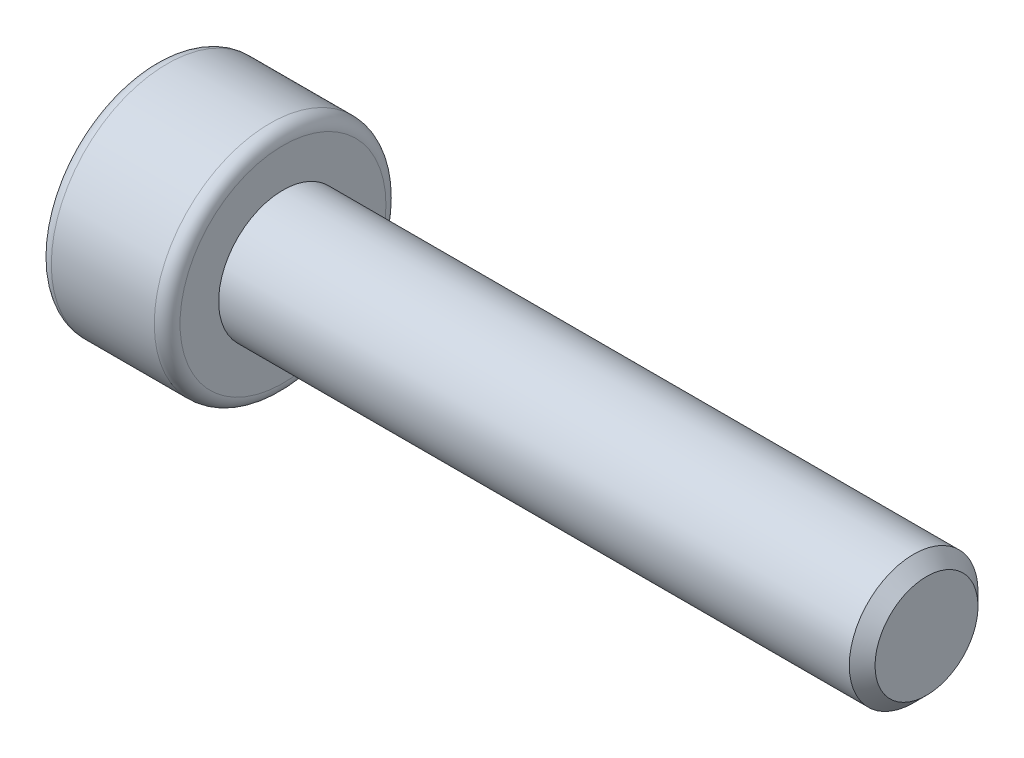
ISO-10303-21;
HEADER;
FILE_DESCRIPTION(('STEP AP214'),'2;1');
FILE_NAME('part.step','',(''),(''),'','','');
FILE_SCHEMA(('AUTOMOTIVE_DESIGN { 1 0 10303 214 1 1 1 1 }'));
ENDSEC;
DATA;
#1=APPLICATION_CONTEXT('core data for automotive mechanical design processes');
#2=APPLICATION_PROTOCOL_DEFINITION('international standard','automotive_design',2000,#1);
#3=PRODUCT_CONTEXT('',#1,'mechanical');
#4=PRODUCT('Part','Part','',(#3));
#5=PRODUCT_RELATED_PRODUCT_CATEGORY('part','',(#4));
#6=PRODUCT_DEFINITION_FORMATION('','',#4);
#7=PRODUCT_DEFINITION_CONTEXT('part definition',#1,'design');
#8=PRODUCT_DEFINITION('design','',#6,#7);
#9=PRODUCT_DEFINITION_SHAPE('','',#8);
#10=(LENGTH_UNIT() NAMED_UNIT(*) SI_UNIT(.MILLI.,.METRE.));
#11=(NAMED_UNIT(*) PLANE_ANGLE_UNIT() SI_UNIT($,.RADIAN.));
#12=(NAMED_UNIT(*) SI_UNIT($,.STERADIAN.) SOLID_ANGLE_UNIT());
#13=UNCERTAINTY_MEASURE_WITH_UNIT(LENGTH_MEASURE(1.E-05),#10,'distance_accuracy_value','');
#14=(GEOMETRIC_REPRESENTATION_CONTEXT(3) GLOBAL_UNCERTAINTY_ASSIGNED_CONTEXT((#13)) GLOBAL_UNIT_ASSIGNED_CONTEXT((#10,
#11,#12)) REPRESENTATION_CONTEXT('',''));
#15=CARTESIAN_POINT('',(0.,0.,0.));
#16=DIRECTION('',(0.,0.,1.));
#17=DIRECTION('',(1.,0.,0.));
#18=AXIS2_PLACEMENT_3D('',#15,#16,#17);
#19=CARTESIAN_POINT('',(-6.,0.,0.));
#20=DIRECTION('',(-1.,0.,0.));
#21=DIRECTION('',(0.,0.,1.));
#22=AXIS2_PLACEMENT_3D('',#19,#20,#21);
#23=PLANE('',#22);
#24=CARTESIAN_POINT('',(-6.,0.,0.));
#25=DIRECTION('',(-1.,0.,0.));
#26=DIRECTION('',(0.,0.,1.));
#27=AXIS2_PLACEMENT_3D('',#24,#25,#26);
#28=CIRCLE('',#27,1.6);
#29=CARTESIAN_POINT('',(-6.,0.,1.6));
#30=VERTEX_POINT('',#29);
#31=EDGE_CURVE('E157',#30,#30,#28,.T.);
#32=ORIENTED_EDGE('',*,*,#31,.T.);
#33=EDGE_LOOP('',(#32));
#34=FACE_BOUND('',#33,.T.);
#35=DIRECTION('',(0.,0.866025403784439,0.5));
#36=VECTOR('',#35,1.);
#37=CARTESIAN_POINT('',(-6.,-0.75,0.43301270189222));
#38=LINE('',#37,#36);
#39=CARTESIAN_POINT('',(-6.,-0.75,0.43301270189222));
#40=VERTEX_POINT('',#39);
#41=CARTESIAN_POINT('',(-6.,0.,0.866025403784439));
#42=VERTEX_POINT('',#41);
#43=EDGE_CURVE('E53',#40,#42,#38,.T.);
#44=ORIENTED_EDGE('',*,*,#43,.F.);
#45=DIRECTION('',(0.,0.,1.));
#46=VECTOR('',#45,1.);
#47=CARTESIAN_POINT('',(-6.,-0.75,-0.433012701892219));
#48=LINE('',#47,#46);
#49=CARTESIAN_POINT('',(-6.,-0.75,-0.433012701892219));
#50=VERTEX_POINT('',#49);
#51=EDGE_CURVE('E136',#50,#40,#48,.T.);
#52=ORIENTED_EDGE('',*,*,#51,.F.);
#53=DIRECTION('',(0.,-0.866025403784438,0.5));
#54=VECTOR('',#53,1.);
#55=CARTESIAN_POINT('',(-6.,0.,-0.866025403784439));
#56=LINE('',#55,#54);
#57=CARTESIAN_POINT('',(-6.,0.,-0.866025403784439));
#58=VERTEX_POINT('',#57);
#59=EDGE_CURVE('E134',#58,#50,#56,.T.);
#60=ORIENTED_EDGE('',*,*,#59,.F.);
#61=DIRECTION('',(0.,-0.866025403784438,-0.5));
#62=VECTOR('',#61,1.);
#63=CARTESIAN_POINT('',(-6.,0.75,-0.433012701892219));
#64=LINE('',#63,#62);
#65=CARTESIAN_POINT('',(-6.,0.75,-0.433012701892219));
#66=VERTEX_POINT('',#65);
#67=EDGE_CURVE('E101',#66,#58,#64,.T.);
#68=ORIENTED_EDGE('',*,*,#67,.F.);
#69=DIRECTION('',(0.,0.,-1.));
#70=VECTOR('',#69,1.);
#71=CARTESIAN_POINT('',(-6.,0.75,0.433012701892219));
#72=LINE('',#71,#70);
#73=CARTESIAN_POINT('',(-6.,0.75,0.433012701892219));
#74=VERTEX_POINT('',#73);
#75=EDGE_CURVE('E130',#74,#66,#72,.T.);
#76=ORIENTED_EDGE('',*,*,#75,.F.);
#77=DIRECTION('',(0.,0.866025403784438,-0.5));
#78=VECTOR('',#77,1.);
#79=CARTESIAN_POINT('',(-6.,0.,0.866025403784439));
#80=LINE('',#79,#78);
#81=EDGE_CURVE('E127',#42,#74,#80,.T.);
#82=ORIENTED_EDGE('',*,*,#81,.F.);
#83=EDGE_LOOP('',(#44,#52,#60,#68,#76,#82));
#84=FACE_BOUND('',#83,.T.);
#85=ADVANCED_FACE('F37',(#34,#84),#23,.T.);
#86=CARTESIAN_POINT('',(6.,0.,0.));
#87=DIRECTION('',(1.,0.,0.));
#88=DIRECTION('',(0.,0.,-1.));
#89=AXIS2_PLACEMENT_3D('',#86,#87,#88);
#90=CYLINDRICAL_SURFACE('',#89,1.8);
#91=CARTESIAN_POINT('',(-4.2,0.,0.));
#92=DIRECTION('',(1.,0.,0.));
#93=DIRECTION('',(0.,0.,-1.));
#94=AXIS2_PLACEMENT_3D('',#91,#92,#93);
#95=CIRCLE('',#94,1.8);
#96=CARTESIAN_POINT('',(-4.2,0.,-1.8));
#97=VERTEX_POINT('',#96);
#98=EDGE_CURVE('E154',#97,#97,#95,.F.);
#99=ORIENTED_EDGE('',*,*,#98,.T.);
#100=EDGE_LOOP('',(#99));
#101=FACE_BOUND('',#100,.T.);
#102=CARTESIAN_POINT('',(-5.8,0.,0.));
#103=DIRECTION('',(-1.,0.,0.));
#104=DIRECTION('',(0.,0.,1.));
#105=AXIS2_PLACEMENT_3D('',#102,#103,#104);
#106=CIRCLE('',#105,1.8);
#107=CARTESIAN_POINT('',(-5.8,0.,1.8));
#108=VERTEX_POINT('',#107);
#109=EDGE_CURVE('E151',#108,#108,#106,.F.);
#110=ORIENTED_EDGE('',*,*,#109,.T.);
#111=EDGE_LOOP('',(#110));
#112=FACE_BOUND('',#111,.T.);
#113=ADVANCED_FACE('F174',(#101,#112),#90,.T.);
#114=CARTESIAN_POINT('',(-4.,1.8,0.));
#115=DIRECTION('',(1.,0.,0.));
#116=DIRECTION('',(0.,0.,-1.));
#117=AXIS2_PLACEMENT_3D('',#114,#115,#116);
#118=PLANE('',#117);
#119=CARTESIAN_POINT('',(-4.,0.,0.));
#120=DIRECTION('',(1.,0.,0.));
#121=DIRECTION('',(0.,0.,-1.));
#122=AXIS2_PLACEMENT_3D('',#119,#120,#121);
#123=CIRCLE('',#122,1.6);
#124=CARTESIAN_POINT('',(-4.,0.,-1.6));
#125=VERTEX_POINT('',#124);
#126=EDGE_CURVE('E148',#125,#125,#123,.T.);
#127=ORIENTED_EDGE('',*,*,#126,.T.);
#128=EDGE_LOOP('',(#127));
#129=FACE_BOUND('',#128,.T.);
#130=CARTESIAN_POINT('',(-4.,0.,0.));
#131=DIRECTION('',(1.,0.,0.));
#132=DIRECTION('',(0.,0.,-1.));
#133=AXIS2_PLACEMENT_3D('',#130,#131,#132);
#134=CIRCLE('',#133,1.);
#135=CARTESIAN_POINT('',(-4.,0.,-1.));
#136=VERTEX_POINT('',#135);
#137=EDGE_CURVE('E140',#136,#136,#134,.T.);
#138=ORIENTED_EDGE('',*,*,#137,.F.);
#139=EDGE_LOOP('',(#138));
#140=FACE_BOUND('',#139,.T.);
#141=ADVANCED_FACE('F180',(#129,#140),#118,.T.);
#142=CARTESIAN_POINT('',(6.,0.,0.));
#143=DIRECTION('',(1.,0.,0.));
#144=DIRECTION('',(0.,0.,-1.));
#145=AXIS2_PLACEMENT_3D('',#142,#143,#144);
#146=CYLINDRICAL_SURFACE('',#145,1.);
#147=CARTESIAN_POINT('',(5.8,0.,0.));
#148=DIRECTION('',(1.,0.,0.));
#149=DIRECTION('',(0.,0.,-1.));
#150=AXIS2_PLACEMENT_3D('',#147,#148,#149);
#151=CIRCLE('',#150,1.);
#152=CARTESIAN_POINT('',(5.8,0.,1.));
#153=VERTEX_POINT('',#152);
#154=EDGE_CURVE('E11',#153,#153,#151,.F.);
#155=ORIENTED_EDGE('',*,*,#154,.T.);
#156=EDGE_LOOP('',(#155));
#157=FACE_BOUND('',#156,.T.);
#158=ORIENTED_EDGE('',*,*,#137,.T.);
#159=EDGE_LOOP('',(#158));
#160=FACE_BOUND('',#159,.T.);
#161=ADVANCED_FACE('F199',(#157,#160),#146,.T.);
#162=CARTESIAN_POINT('',(6.,1.,0.));
#163=DIRECTION('',(1.,0.,0.));
#164=DIRECTION('',(0.,0.,-1.));
#165=AXIS2_PLACEMENT_3D('',#162,#163,#164);
#166=PLANE('',#165);
#167=CARTESIAN_POINT('',(6.,0.,0.));
#168=DIRECTION('',(1.,0.,0.));
#169=DIRECTION('',(0.,0.,-1.));
#170=AXIS2_PLACEMENT_3D('',#167,#168,#169);
#171=CIRCLE('',#170,0.800000000000002);
#172=CARTESIAN_POINT('',(6.,0.,0.800000000000002));
#173=VERTEX_POINT('',#172);
#174=EDGE_CURVE('E46',#173,#173,#171,.T.);
#175=ORIENTED_EDGE('',*,*,#174,.T.);
#176=EDGE_LOOP('',(#175));
#177=FACE_BOUND('',#176,.T.);
#178=ADVANCED_FACE('F162',(#177),#166,.T.);
#179=CARTESIAN_POINT('',(-4.5,-0.75,0.43301270189222));
#180=DIRECTION('',(0.,-0.5,0.866025403784439));
#181=DIRECTION('',(0.,-0.866025403784439,-0.5));
#182=AXIS2_PLACEMENT_3D('',#179,#180,#181);
#183=PLANE('',#182);
#184=ORIENTED_EDGE('',*,*,#43,.T.);
#185=DIRECTION('',(-1.,0.,0.));
#186=VECTOR('',#185,1.);
#187=CARTESIAN_POINT('',(-4.5,0.,0.866025403784439));
#188=LINE('',#187,#186);
#189=CARTESIAN_POINT('',(-4.5,0.,0.866025403784439));
#190=VERTEX_POINT('',#189);
#191=EDGE_CURVE('E83',#190,#42,#188,.T.);
#192=ORIENTED_EDGE('',*,*,#191,.F.);
#193=DIRECTION('',(0.,0.866025403784439,0.5));
#194=VECTOR('',#193,1.);
#195=CARTESIAN_POINT('',(-4.5,-0.75,0.43301270189222));
#196=LINE('',#195,#194);
#197=CARTESIAN_POINT('',(-4.5,-0.75,0.43301270189222));
#198=VERTEX_POINT('',#197);
#199=EDGE_CURVE('E138',#198,#190,#196,.T.);
#200=ORIENTED_EDGE('',*,*,#199,.F.);
#201=DIRECTION('',(-1.,0.,0.));
#202=VECTOR('',#201,1.);
#203=CARTESIAN_POINT('',(-4.5,-0.75,0.43301270189222));
#204=LINE('',#203,#202);
#205=EDGE_CURVE('E61',#198,#40,#204,.T.);
#206=ORIENTED_EDGE('',*,*,#205,.T.);
#207=EDGE_LOOP('',(#184,#192,#200,#206));
#208=FACE_BOUND('',#207,.T.);
#209=ADVANCED_FACE('F208',(#208),#183,.F.);
#210=CARTESIAN_POINT('',(-4.5,-0.75,-0.433012701892219));
#211=DIRECTION('',(0.,-1.,0.));
#212=DIRECTION('',(0.,0.,-1.));
#213=AXIS2_PLACEMENT_3D('',#210,#211,#212);
#214=PLANE('',#213);
#215=ORIENTED_EDGE('',*,*,#51,.T.);
#216=ORIENTED_EDGE('',*,*,#205,.F.);
#217=DIRECTION('',(0.,0.,1.));
#218=VECTOR('',#217,1.);
#219=CARTESIAN_POINT('',(-4.5,-0.75,-0.433012701892219));
#220=LINE('',#219,#218);
#221=CARTESIAN_POINT('',(-4.5,-0.75,-0.433012701892219));
#222=VERTEX_POINT('',#221);
#223=EDGE_CURVE('E113',#222,#198,#220,.T.);
#224=ORIENTED_EDGE('',*,*,#223,.F.);
#225=DIRECTION('',(-1.,0.,0.));
#226=VECTOR('',#225,1.);
#227=CARTESIAN_POINT('',(-4.5,-0.75,-0.433012701892219));
#228=LINE('',#227,#226);
#229=EDGE_CURVE('E105',#222,#50,#228,.T.);
#230=ORIENTED_EDGE('',*,*,#229,.T.);
#231=EDGE_LOOP('',(#215,#216,#224,#230));
#232=FACE_BOUND('',#231,.T.);
#233=ADVANCED_FACE('F213',(#232),#214,.F.);
#234=CARTESIAN_POINT('',(-4.5,0.,-0.866025403784439));
#235=DIRECTION('',(0.,-0.5,-0.866025403784438));
#236=DIRECTION('',(0.,0.866025403784439,-0.5));
#237=AXIS2_PLACEMENT_3D('',#234,#235,#236);
#238=PLANE('',#237);
#239=ORIENTED_EDGE('',*,*,#59,.T.);
#240=ORIENTED_EDGE('',*,*,#229,.F.);
#241=DIRECTION('',(0.,-0.866025403784438,0.5));
#242=VECTOR('',#241,1.);
#243=CARTESIAN_POINT('',(-4.5,0.,-0.866025403784439));
#244=LINE('',#243,#242);
#245=CARTESIAN_POINT('',(-4.5,0.,-0.866025403784439));
#246=VERTEX_POINT('',#245);
#247=EDGE_CURVE('E109',#246,#222,#244,.T.);
#248=ORIENTED_EDGE('',*,*,#247,.F.);
#249=DIRECTION('',(-1.,0.,0.));
#250=VECTOR('',#249,1.);
#251=CARTESIAN_POINT('',(-4.5,0.,-0.866025403784439));
#252=LINE('',#251,#250);
#253=EDGE_CURVE('E94',#246,#58,#252,.T.);
#254=ORIENTED_EDGE('',*,*,#253,.T.);
#255=EDGE_LOOP('',(#239,#240,#248,#254));
#256=FACE_BOUND('',#255,.T.);
#257=ADVANCED_FACE('F110',(#256),#238,.F.);
#258=CARTESIAN_POINT('',(-4.5,0.75,-0.433012701892219));
#259=DIRECTION('',(0.,0.5,-0.866025403784439));
#260=DIRECTION('',(0.,0.866025403784439,0.5));
#261=AXIS2_PLACEMENT_3D('',#258,#259,#260);
#262=PLANE('',#261);
#263=ORIENTED_EDGE('',*,*,#67,.T.);
#264=ORIENTED_EDGE('',*,*,#253,.F.);
#265=DIRECTION('',(0.,-0.866025403784438,-0.5));
#266=VECTOR('',#265,1.);
#267=CARTESIAN_POINT('',(-4.5,0.75,-0.433012701892219));
#268=LINE('',#267,#266);
#269=CARTESIAN_POINT('',(-4.5,0.75,-0.433012701892219));
#270=VERTEX_POINT('',#269);
#271=EDGE_CURVE('E98',#270,#246,#268,.T.);
#272=ORIENTED_EDGE('',*,*,#271,.F.);
#273=DIRECTION('',(-1.,0.,0.));
#274=VECTOR('',#273,1.);
#275=CARTESIAN_POINT('',(-4.5,0.75,-0.433012701892219));
#276=LINE('',#275,#274);
#277=EDGE_CURVE('E106',#270,#66,#276,.T.);
#278=ORIENTED_EDGE('',*,*,#277,.T.);
#279=EDGE_LOOP('',(#263,#264,#272,#278));
#280=FACE_BOUND('',#279,.T.);
#281=ADVANCED_FACE('F96',(#280),#262,.F.);
#282=CARTESIAN_POINT('',(-4.5,0.75,0.433012701892219));
#283=DIRECTION('',(0.,1.,0.));
#284=DIRECTION('',(0.,0.,1.));
#285=AXIS2_PLACEMENT_3D('',#282,#283,#284);
#286=PLANE('',#285);
#287=ORIENTED_EDGE('',*,*,#75,.T.);
#288=ORIENTED_EDGE('',*,*,#277,.F.);
#289=DIRECTION('',(0.,0.,-1.));
#290=VECTOR('',#289,1.);
#291=CARTESIAN_POINT('',(-4.5,0.75,0.433012701892219));
#292=LINE('',#291,#290);
#293=CARTESIAN_POINT('',(-4.5,0.75,0.433012701892219));
#294=VERTEX_POINT('',#293);
#295=EDGE_CURVE('E119',#294,#270,#292,.T.);
#296=ORIENTED_EDGE('',*,*,#295,.F.);
#297=DIRECTION('',(-1.,0.,0.));
#298=VECTOR('',#297,1.);
#299=CARTESIAN_POINT('',(-4.5,0.75,0.433012701892219));
#300=LINE('',#299,#298);
#301=EDGE_CURVE('E143',#294,#74,#300,.T.);
#302=ORIENTED_EDGE('',*,*,#301,.T.);
#303=EDGE_LOOP('',(#287,#288,#296,#302));
#304=FACE_BOUND('',#303,.T.);
#305=ADVANCED_FACE('F216',(#304),#286,.F.);
#306=CARTESIAN_POINT('',(-4.5,0.,0.866025403784439));
#307=DIRECTION('',(0.,0.5,0.866025403784439));
#308=DIRECTION('',(0.,-0.866025403784439,0.5));
#309=AXIS2_PLACEMENT_3D('',#306,#307,#308);
#310=PLANE('',#309);
#311=ORIENTED_EDGE('',*,*,#81,.T.);
#312=ORIENTED_EDGE('',*,*,#301,.F.);
#313=DIRECTION('',(0.,0.866025403784438,-0.5));
#314=VECTOR('',#313,1.);
#315=CARTESIAN_POINT('',(-4.5,0.,0.866025403784439));
#316=LINE('',#315,#314);
#317=EDGE_CURVE('E121',#190,#294,#316,.T.);
#318=ORIENTED_EDGE('',*,*,#317,.F.);
#319=ORIENTED_EDGE('',*,*,#191,.T.);
#320=EDGE_LOOP('',(#311,#312,#318,#319));
#321=FACE_BOUND('',#320,.T.);
#322=ADVANCED_FACE('F191',(#321),#310,.F.);
#323=CARTESIAN_POINT('',(-4.5,0.,0.));
#324=DIRECTION('',(-1.,0.,0.));
#325=DIRECTION('',(0.,0.,1.));
#326=AXIS2_PLACEMENT_3D('',#323,#324,#325);
#327=PLANE('',#326);
#328=ORIENTED_EDGE('',*,*,#199,.T.);
#329=ORIENTED_EDGE('',*,*,#317,.T.);
#330=ORIENTED_EDGE('',*,*,#295,.T.);
#331=ORIENTED_EDGE('',*,*,#271,.T.);
#332=ORIENTED_EDGE('',*,*,#247,.T.);
#333=ORIENTED_EDGE('',*,*,#223,.T.);
#334=EDGE_LOOP('',(#328,#329,#330,#331,#332,#333));
#335=FACE_BOUND('',#334,.T.);
#336=ADVANCED_FACE('F116',(#335),#327,.T.);
#337=CARTESIAN_POINT('',(-4.2,0.,0.));
#338=DIRECTION('',(1.,0.,0.));
#339=DIRECTION('',(0.,0.,-1.));
#340=AXIS2_PLACEMENT_3D('',#337,#338,#339);
#341=TOROIDAL_SURFACE('',#340,1.6,0.2);
#342=ORIENTED_EDGE('',*,*,#98,.F.);
#343=EDGE_LOOP('',(#342));
#344=FACE_BOUND('',#343,.T.);
#345=ORIENTED_EDGE('',*,*,#126,.F.);
#346=EDGE_LOOP('',(#345));
#347=FACE_BOUND('',#346,.T.);
#348=ADVANCED_FACE('F170',(#344,#347),#341,.T.);
#349=CARTESIAN_POINT('',(-5.8,0.,0.));
#350=DIRECTION('',(-1.,0.,0.));
#351=DIRECTION('',(0.,0.,1.));
#352=AXIS2_PLACEMENT_3D('',#349,#350,#351);
#353=TOROIDAL_SURFACE('',#352,1.6,0.2);
#354=ORIENTED_EDGE('',*,*,#31,.F.);
#355=EDGE_LOOP('',(#354));
#356=FACE_BOUND('',#355,.T.);
#357=ORIENTED_EDGE('',*,*,#109,.F.);
#358=EDGE_LOOP('',(#357));
#359=FACE_BOUND('',#358,.T.);
#360=ADVANCED_FACE('F165',(#356,#359),#353,.T.);
#361=CARTESIAN_POINT('',(6.,0.,0.));
#362=DIRECTION('',(-1.,0.,0.));
#363=DIRECTION('',(0.,0.,1.));
#364=AXIS2_PLACEMENT_3D('',#361,#362,#363);
#365=CONICAL_SURFACE('',#364,0.800000000000002,0.785398163397449);
#366=CARTESIAN_POINT('',(5.8,0.,1.));
#367=CARTESIAN_POINT('',(5.80208333333333,0.,0.997916666666669));
#368=CARTESIAN_POINT('',(5.80416666666667,0.,0.995833333333336));
#369=CARTESIAN_POINT('',(5.80833333333333,0.,0.991666666666669));
#370=CARTESIAN_POINT('',(5.81041666666667,0.,0.989583333333336));
#371=CARTESIAN_POINT('',(5.81458333333333,0.,0.985416666666669));
#372=CARTESIAN_POINT('',(5.81666666666667,0.,0.983333333333336));
#373=CARTESIAN_POINT('',(5.82083333333333,0.,0.979166666666669));
#374=CARTESIAN_POINT('',(5.82291666666667,0.,0.977083333333336));
#375=CARTESIAN_POINT('',(5.82708333333333,0.,0.972916666666669));
#376=CARTESIAN_POINT('',(5.82916666666667,0.,0.970833333333336));
#377=CARTESIAN_POINT('',(5.83333333333333,0.,0.966666666666669));
#378=CARTESIAN_POINT('',(5.83541666666667,0.,0.964583333333336));
#379=CARTESIAN_POINT('',(5.83958333333333,0.,0.960416666666669));
#380=CARTESIAN_POINT('',(5.84166666666667,0.,0.958333333333336));
#381=CARTESIAN_POINT('',(5.84583333333333,0.,0.954166666666669));
#382=CARTESIAN_POINT('',(5.84791666666667,0.,0.952083333333336));
#383=CARTESIAN_POINT('',(5.85208333333333,0.,0.947916666666669));
#384=CARTESIAN_POINT('',(5.85416666666667,0.,0.945833333333336));
#385=CARTESIAN_POINT('',(5.85833333333333,0.,0.941666666666669));
#386=CARTESIAN_POINT('',(5.86041666666667,0.,0.939583333333336));
#387=CARTESIAN_POINT('',(5.86458333333333,0.,0.935416666666669));
#388=CARTESIAN_POINT('',(5.86666666666667,0.,0.933333333333336));
#389=CARTESIAN_POINT('',(5.87083333333333,0.,0.929166666666669));
#390=CARTESIAN_POINT('',(5.87291666666667,0.,0.927083333333336));
#391=CARTESIAN_POINT('',(5.87708333333333,0.,0.922916666666669));
#392=CARTESIAN_POINT('',(5.87916666666667,0.,0.920833333333336));
#393=CARTESIAN_POINT('',(5.88333333333333,0.,0.916666666666669));
#394=CARTESIAN_POINT('',(5.88541666666667,0.,0.914583333333336));
#395=CARTESIAN_POINT('',(5.88958333333333,0.,0.910416666666669));
#396=CARTESIAN_POINT('',(5.89166666666667,0.,0.908333333333336));
#397=CARTESIAN_POINT('',(5.89583333333333,0.,0.904166666666669));
#398=CARTESIAN_POINT('',(5.89791666666667,0.,0.902083333333336));
#399=CARTESIAN_POINT('',(5.90208333333333,0.,0.897916666666669));
#400=CARTESIAN_POINT('',(5.90416666666667,0.,0.895833333333336));
#401=CARTESIAN_POINT('',(5.90833333333333,0.,0.891666666666669));
#402=CARTESIAN_POINT('',(5.91041666666667,0.,0.889583333333336));
#403=CARTESIAN_POINT('',(5.91458333333333,0.,0.885416666666669));
#404=CARTESIAN_POINT('',(5.91666666666667,0.,0.883333333333336));
#405=CARTESIAN_POINT('',(5.92083333333333,0.,0.879166666666669));
#406=CARTESIAN_POINT('',(5.92291666666667,0.,0.877083333333336));
#407=CARTESIAN_POINT('',(5.92708333333333,0.,0.872916666666669));
#408=CARTESIAN_POINT('',(5.92916666666667,0.,0.870833333333336));
#409=CARTESIAN_POINT('',(5.93333333333333,0.,0.866666666666669));
#410=CARTESIAN_POINT('',(5.93541666666667,0.,0.864583333333336));
#411=CARTESIAN_POINT('',(5.93958333333333,0.,0.860416666666669));
#412=CARTESIAN_POINT('',(5.94166666666667,0.,0.858333333333336));
#413=CARTESIAN_POINT('',(5.94583333333333,0.,0.854166666666669));
#414=CARTESIAN_POINT('',(5.94791666666667,0.,0.852083333333336));
#415=CARTESIAN_POINT('',(5.95208333333333,0.,0.847916666666669));
#416=CARTESIAN_POINT('',(5.95416666666667,0.,0.845833333333336));
#417=CARTESIAN_POINT('',(5.95833333333333,0.,0.841666666666669));
#418=CARTESIAN_POINT('',(5.96041666666667,0.,0.839583333333336));
#419=CARTESIAN_POINT('',(5.96458333333333,0.,0.835416666666669));
#420=CARTESIAN_POINT('',(5.96666666666667,0.,0.833333333333336));
#421=CARTESIAN_POINT('',(5.97083333333333,0.,0.829166666666669));
#422=CARTESIAN_POINT('',(5.97291666666667,0.,0.827083333333336));
#423=CARTESIAN_POINT('',(5.97708333333333,0.,0.822916666666669));
#424=CARTESIAN_POINT('',(5.97916666666667,0.,0.820833333333336));
#425=CARTESIAN_POINT('',(5.98333333333333,0.,0.816666666666669));
#426=CARTESIAN_POINT('',(5.98541666666667,0.,0.814583333333336));
#427=CARTESIAN_POINT('',(5.98958333333333,0.,0.810416666666669));
#428=CARTESIAN_POINT('',(5.99166666666667,0.,0.808333333333336));
#429=CARTESIAN_POINT('',(5.99583333333333,0.,0.804166666666669));
#430=CARTESIAN_POINT('',(5.99791666666667,0.,0.802083333333336));
#431=CARTESIAN_POINT('',(6.,0.,0.800000000000002));
#432=B_SPLINE_CURVE_WITH_KNOTS('',3,(#366,#367,#368,#369,#370,#371,#372,#373,#374,#375,#376,
#377,#378,#379,#380,#381,#382,#383,#384,#385,#386,#387,#388,#389,#390,#391,#392,#393,#394,#395,
#396,#397,#398,#399,#400,#401,#402,#403,#404,#405,#406,#407,#408,#409,#410,#411,#412,#413,#414,
#415,#416,#417,#418,#419,#420,#421,#422,#423,#424,#425,#426,#427,#428,#429,#430,#431),
.UNSPECIFIED.,.F.,.F.,(4,2,2,2,2,2,2,2,2,2,2,2,2,2,2,2,2,2,2,2,2,2,2,2,2,2,2,2,2,2,2,2,4),(0.,
0.00883883476483133,0.0176776695296633,0.0265165042944954,0.0353553390593273,0.0441941738241586,
0.0530330085889906,0.0618718433538225,0.0707106781186546,0.0795495128834865,0.0883883476483179,
0.0972271824131498,0.106066017177982,0.114904851942814,0.123743686707645,0.132582521472477,
0.141421356237309,0.150260191002141,0.159099025766973,0.167937860531804,0.176776695296636,
0.185615530061468,0.1944543648263,0.203293199591132,0.212132034355964,0.220970869120796,
0.229809703885628,0.23864853865046,0.247487373415291,0.256326208180123,0.265165042944955,
0.274003877709787,0.282842712474619),.UNSPECIFIED.);
#433=EDGE_CURVE('BSEAM40',#153,#173,#432,.T.);
#434=ORIENTED_EDGE('',*,*,#154,.F.);
#435=ORIENTED_EDGE('',*,*,#174,.F.);
#436=ORIENTED_EDGE('',*,*,#433,.T.);
#437=ORIENTED_EDGE('',*,*,#433,.F.);
#438=EDGE_LOOP('',(#434,#436,#435,#437));
#439=FACE_BOUND('',#438,.T.);
#440=ADVANCED_FACE('F40',(#439),#365,.T.);
#441=CLOSED_SHELL('',(#85,#113,#141,#161,#178,#209,#233,#257,#281,#305,#322,#336,#348,#360,#440));
#442=MANIFOLD_SOLID_BREP('B2',#441);
#443=ADVANCED_BREP_SHAPE_REPRESENTATION('',(#18,#442),#14);
#444=SHAPE_DEFINITION_REPRESENTATION(#9,#443);
ENDSEC;
END-ISO-10303-21;
